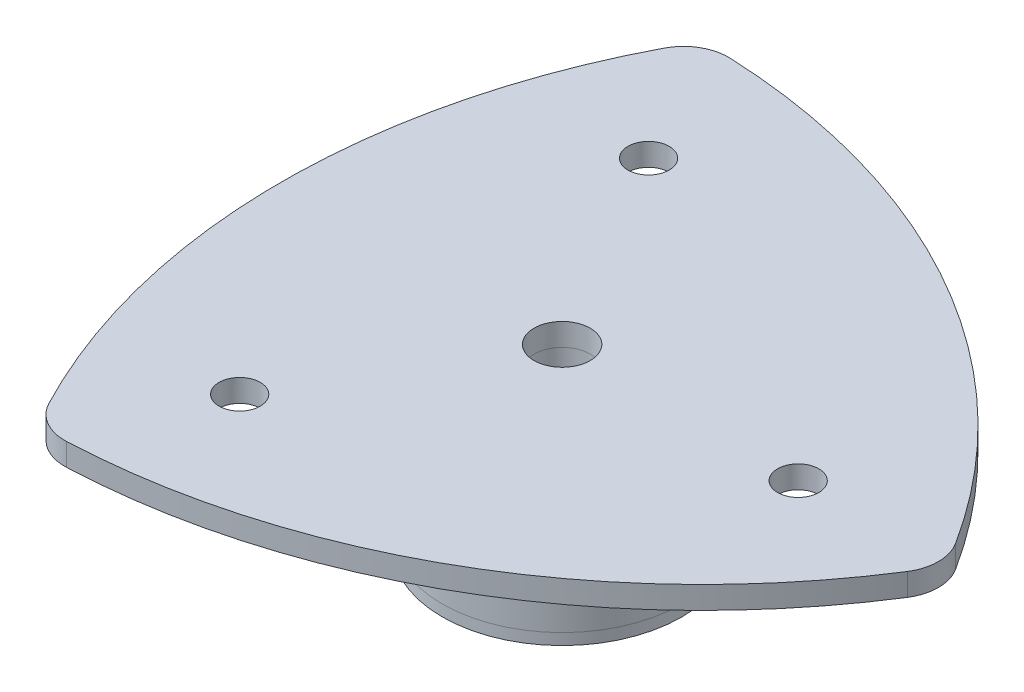
ISO-10303-21;
HEADER;
FILE_DESCRIPTION(('STEP AP214'),'2;1');
FILE_NAME('part.step','',(''),(''),'','','');
FILE_SCHEMA(('AUTOMOTIVE_DESIGN { 1 0 10303 214 1 1 1 1 }'));
ENDSEC;
DATA;
#1=APPLICATION_CONTEXT('core data for automotive mechanical design processes');
#2=APPLICATION_PROTOCOL_DEFINITION('international standard','automotive_design',2000,#1);
#3=PRODUCT_CONTEXT('',#1,'mechanical');
#4=PRODUCT('Part','Part','',(#3));
#5=PRODUCT_RELATED_PRODUCT_CATEGORY('part','',(#4));
#6=PRODUCT_DEFINITION_FORMATION('','',#4);
#7=PRODUCT_DEFINITION_CONTEXT('part definition',#1,'design');
#8=PRODUCT_DEFINITION('design','',#6,#7);
#9=PRODUCT_DEFINITION_SHAPE('','',#8);
#10=(LENGTH_UNIT() NAMED_UNIT(*) SI_UNIT(.MILLI.,.METRE.));
#11=(NAMED_UNIT(*) PLANE_ANGLE_UNIT() SI_UNIT($,.RADIAN.));
#12=(NAMED_UNIT(*) SI_UNIT($,.STERADIAN.) SOLID_ANGLE_UNIT());
#13=UNCERTAINTY_MEASURE_WITH_UNIT(LENGTH_MEASURE(1.E-05),#10,'distance_accuracy_value','');
#14=(GEOMETRIC_REPRESENTATION_CONTEXT(3) GLOBAL_UNCERTAINTY_ASSIGNED_CONTEXT((#13)) GLOBAL_UNIT_ASSIGNED_CONTEXT((#10,
#11,#12)) REPRESENTATION_CONTEXT('',''));
#15=CARTESIAN_POINT('',(0.,0.,0.));
#16=DIRECTION('',(0.,0.,1.));
#17=DIRECTION('',(1.,0.,0.));
#18=AXIS2_PLACEMENT_3D('',#15,#16,#17);
#19=CARTESIAN_POINT('',(0.,47.0000000000002,0.));
#20=DIRECTION('',(0.,1.,0.));
#21=DIRECTION('',(0.,0.,0.999999999999999));
#22=AXIS2_PLACEMENT_3D('',#19,#20,#21);
#23=PLANE('',#22);
#24=CARTESIAN_POINT('',(-31.4999999999999,47.0000000000005,-54.5596004384192));
#25=DIRECTION('',(0.,1.,0.));
#26=DIRECTION('',(0.,0.,0.999999999999999));
#27=AXIS2_PLACEMENT_3D('',#24,#25,#26);
#28=CIRCLE('',#27,5.5);
#29=CARTESIAN_POINT('',(-31.4999999999999,47.0000000000005,-49.0596004384192));
#30=VERTEX_POINT('',#29);
#31=EDGE_CURVE('E491',#30,#30,#28,.T.);
#32=ORIENTED_EDGE('',*,*,#31,.F.);
#33=EDGE_LOOP('',(#32));
#34=FACE_BOUND('',#33,.T.);
#35=CARTESIAN_POINT('',(-31.5000000000001,47.0000000000002,54.5596004384203));
#36=DIRECTION('',(0.,1.,0.));
#37=DIRECTION('',(0.,0.,0.999999999999999));
#38=AXIS2_PLACEMENT_3D('',#35,#36,#37);
#39=CIRCLE('',#38,5.5);
#40=CARTESIAN_POINT('',(-31.5000000000001,47.0000000000002,60.0596004384203));
#41=VERTEX_POINT('',#40);
#42=EDGE_CURVE('E490',#41,#41,#39,.T.);
#43=ORIENTED_EDGE('',*,*,#42,.F.);
#44=EDGE_LOOP('',(#43));
#45=FACE_BOUND('',#44,.T.);
#46=CARTESIAN_POINT('',(63.,47.0000000000003,0.));
#47=DIRECTION('',(0.,1.,0.));
#48=DIRECTION('',(0.,0.,0.999999999999999));
#49=AXIS2_PLACEMENT_3D('',#46,#47,#48);
#50=CIRCLE('',#49,5.5);
#51=CARTESIAN_POINT('',(63.,47.0000000000003,5.50000000000008));
#52=VERTEX_POINT('',#51);
#53=EDGE_CURVE('E480',#52,#52,#50,.T.);
#54=ORIENTED_EDGE('',*,*,#53,.F.);
#55=EDGE_LOOP('',(#54));
#56=FACE_BOUND('',#55,.T.);
#57=CARTESIAN_POINT('',(0.,47.0000000000002,0.));
#58=DIRECTION('',(0.,-1.,0.));
#59=DIRECTION('',(0.,0.,-0.999999999999999));
#60=AXIS2_PLACEMENT_3D('',#57,#58,#59);
#61=CIRCLE('',#60,7.5);
#62=CARTESIAN_POINT('',(0.,47.0000000000001,-7.49999999999997));
#63=VERTEX_POINT('',#62);
#64=EDGE_CURVE('E341',#63,#63,#61,.T.);
#65=ORIENTED_EDGE('',*,*,#64,.T.);
#66=EDGE_LOOP('',(#65));
#67=FACE_BOUND('',#66,.T.);
#68=CARTESIAN_POINT('',(-51.2259526419164,47.0000000000018,88.7259526419169));
#69=DIRECTION('',(0.,1.,0.));
#70=DIRECTION('',(0.,0.,0.999999999999999));
#71=AXIS2_PLACEMENT_3D('',#68,#69,#70);
#72=CIRCLE('',#71,177.451905283833);
#73=CARTESIAN_POINT('',(98.5523471473544,47.0000000000006,-6.43517177923342));
#74=VERTEX_POINT('',#73);
#75=CARTESIAN_POINT('',(-43.703151335144,47.0000000000003,-88.5664221218088));
#76=VERTEX_POINT('',#75);
#77=EDGE_CURVE('E325',#74,#76,#72,.T.);
#78=ORIENTED_EDGE('',*,*,#77,.T.);
#79=CARTESIAN_POINT('',(-44.2118729267036,47.0000000000008,-76.5772102068293));
#80=DIRECTION('',(0.,1.,0.));
#81=DIRECTION('',(0.,0.,0.999999999999999));
#82=AXIS2_PLACEMENT_3D('',#79,#80,#81);
#83=CIRCLE('',#82,12.);
#84=CARTESIAN_POINT('',(-54.8491958122107,47.0000000000018,-82.1312503425742));
#85=VERTEX_POINT('',#84);
#86=EDGE_CURVE('E329',#76,#85,#83,.T.);
#87=ORIENTED_EDGE('',*,*,#86,.T.);
#88=CARTESIAN_POINT('',(102.451905283833,47.,0.));
#89=DIRECTION('',(0.,1.,0.));
#90=DIRECTION('',(0.,0.,0.999999999999999));
#91=AXIS2_PLACEMENT_3D('',#88,#89,#90);
#92=CIRCLE('',#91,177.451905283833);
#93=CARTESIAN_POINT('',(-54.8491958122105,47.0000000000022,82.1312503425755));
#94=VERTEX_POINT('',#93);
#95=EDGE_CURVE('E339',#85,#94,#92,.T.);
#96=ORIENTED_EDGE('',*,*,#95,.T.);
#97=CARTESIAN_POINT('',(-44.2118729267036,47.0000000000022,76.5772102068303));
#98=DIRECTION('',(0.,1.,0.));
#99=DIRECTION('',(0.,0.,0.999999999999999));
#100=AXIS2_PLACEMENT_3D('',#97,#98,#99);
#101=CIRCLE('',#100,12.);
#102=CARTESIAN_POINT('',(-43.703151335144,47.0000000000002,88.5664221218089));
#103=VERTEX_POINT('',#102);
#104=EDGE_CURVE('E328',#94,#103,#101,.T.);
#105=ORIENTED_EDGE('',*,*,#104,.T.);
#106=CARTESIAN_POINT('',(-51.2259526419165,47.0000000000005,-88.7259526419162));
#107=DIRECTION('',(0.,1.,0.));
#108=DIRECTION('',(0.,0.,0.999999999999999));
#109=AXIS2_PLACEMENT_3D('',#106,#107,#108);
#110=CIRCLE('',#109,177.451905283833);
#111=CARTESIAN_POINT('',(98.5523471473546,47.0000000000019,6.43517177923442));
#112=VERTEX_POINT('',#111);
#113=EDGE_CURVE('E324',#103,#112,#110,.T.);
#114=ORIENTED_EDGE('',*,*,#113,.T.);
#115=CARTESIAN_POINT('',(88.4237458534072,47.0000000000009,1.66533453693773E-13));
#116=DIRECTION('',(0.,1.,0.));
#117=DIRECTION('',(0.,0.,0.999999999999999));
#118=AXIS2_PLACEMENT_3D('',#115,#116,#117);
#119=CIRCLE('',#118,12.);
#120=EDGE_CURVE('E318',#112,#74,#119,.T.);
#121=ORIENTED_EDGE('',*,*,#120,.T.);
#122=EDGE_LOOP('',(#78,#87,#96,#105,#114,#121));
#123=FACE_BOUND('',#122,.T.);
#124=ADVANCED_FACE('F265',(#34,#45,#56,#67,#123),#23,.T.);
#125=CARTESIAN_POINT('',(0.,0.,0.));
#126=DIRECTION('',(0.,-1.,0.));
#127=DIRECTION('',(0.,0.,-0.999999999999999));
#128=AXIS2_PLACEMENT_3D('',#125,#126,#127);
#129=CYLINDRICAL_SURFACE('',#128,7.5);
#130=CARTESIAN_POINT('',(0.,41.,0.));
#131=DIRECTION('',(0.,-1.,0.));
#132=DIRECTION('',(0.,0.,-0.999999999999999));
#133=AXIS2_PLACEMENT_3D('',#130,#131,#132);
#134=CIRCLE('',#133,7.5);
#135=CARTESIAN_POINT('',(0.,41.,-7.49999999999994));
#136=VERTEX_POINT('',#135);
#137=EDGE_CURVE('E351',#136,#136,#134,.T.);
#138=ORIENTED_EDGE('',*,*,#137,.T.);
#139=EDGE_LOOP('',(#138));
#140=FACE_BOUND('',#139,.T.);
#141=ORIENTED_EDGE('',*,*,#64,.F.);
#142=EDGE_LOOP('',(#141));
#143=FACE_BOUND('',#142,.T.);
#144=ADVANCED_FACE('F427',(#140,#143),#129,.F.);
#145=CARTESIAN_POINT('',(0.,41.,0.));
#146=DIRECTION('',(0.,1.,0.));
#147=DIRECTION('',(0.,0.,0.999999999999999));
#148=AXIS2_PLACEMENT_3D('',#145,#146,#147);
#149=PLANE('',#148);
#150=ORIENTED_EDGE('',*,*,#137,.F.);
#151=EDGE_LOOP('',(#150));
#152=FACE_BOUND('',#151,.T.);
#153=CARTESIAN_POINT('',(0.,41.,0.));
#154=DIRECTION('',(0.,-1.,0.));
#155=DIRECTION('',(0.,0.,-0.999999999999999));
#156=AXIS2_PLACEMENT_3D('',#153,#154,#155);
#157=CIRCLE('',#156,32.);
#158=CARTESIAN_POINT('',(0.,41.,-31.9999999999999));
#159=VERTEX_POINT('',#158);
#160=EDGE_CURVE('E422',#159,#159,#157,.T.);
#161=ORIENTED_EDGE('',*,*,#160,.T.);
#162=EDGE_LOOP('',(#161));
#163=FACE_BOUND('',#162,.T.);
#164=ADVANCED_FACE('F433',(#152,#163),#149,.F.);
#165=CARTESIAN_POINT('',(0.,0.,0.));
#166=DIRECTION('',(0.,-1.,0.));
#167=DIRECTION('',(0.,0.,-0.999999999999999));
#168=AXIS2_PLACEMENT_3D('',#165,#166,#167);
#169=CYLINDRICAL_SURFACE('',#168,32.);
#170=ORIENTED_EDGE('',*,*,#160,.F.);
#171=EDGE_LOOP('',(#170));
#172=FACE_BOUND('',#171,.T.);
#173=CARTESIAN_POINT('',(-4.16333634234434E-13,27.0000000000019,7.21644966006352E-13));
#174=DIRECTION('',(0.,-1.,0.));
#175=DIRECTION('',(0.,0.,-0.999999999999999));
#176=AXIS2_PLACEMENT_3D('',#173,#174,#175);
#177=CIRCLE('',#176,32.);
#178=CARTESIAN_POINT('',(-4.67847982577041E-13,27.0000000000019,-31.9999999999993));
#179=VERTEX_POINT('',#178);
#180=EDGE_CURVE('E419',#179,#179,#177,.T.);
#181=ORIENTED_EDGE('',*,*,#180,.T.);
#182=EDGE_LOOP('',(#181));
#183=FACE_BOUND('',#182,.T.);
#184=ADVANCED_FACE('F436',(#172,#183),#169,.F.);
#185=CARTESIAN_POINT('',(-4.16333634234434E-13,27.0000000000019,7.21644966006352E-13));
#186=DIRECTION('',(0.,-1.,0.));
#187=DIRECTION('',(0.,0.,-0.999999999999999));
#188=AXIS2_PLACEMENT_3D('',#185,#186,#187);
#189=PLANE('',#188);
#190=CARTESIAN_POINT('',(-4.16333634234434E-13,27.0000000000019,7.21644966006352E-13));
#191=DIRECTION('',(0.,-1.,0.));
#192=DIRECTION('',(0.,0.,-0.999999999999999));
#193=AXIS2_PLACEMENT_3D('',#190,#191,#192);
#194=CIRCLE('',#193,38.);
#195=CARTESIAN_POINT('',(-4.7750692289128E-13,27.0000000000019,-37.9999999999992));
#196=VERTEX_POINT('',#195);
#197=EDGE_CURVE('E413',#196,#196,#194,.T.);
#198=ORIENTED_EDGE('',*,*,#197,.T.);
#199=EDGE_LOOP('',(#198));
#200=FACE_BOUND('',#199,.T.);
#201=ORIENTED_EDGE('',*,*,#180,.F.);
#202=EDGE_LOOP('',(#201));
#203=FACE_BOUND('',#202,.T.);
#204=ADVANCED_FACE('F445',(#200,#203),#189,.T.);
#205=CARTESIAN_POINT('',(0.,0.,0.));
#206=DIRECTION('',(0.,-1.,0.));
#207=DIRECTION('',(0.,0.,-0.999999999999999));
#208=AXIS2_PLACEMENT_3D('',#205,#206,#207);
#209=CYLINDRICAL_SURFACE('',#208,38.);
#210=CARTESIAN_POINT('',(0.,41.,0.));
#211=DIRECTION('',(0.,-1.,0.));
#212=DIRECTION('',(0.,0.,-0.999999999999999));
#213=AXIS2_PLACEMENT_3D('',#210,#211,#212);
#214=CIRCLE('',#213,38.);
#215=CARTESIAN_POINT('',(0.,41.,-37.9999999999999));
#216=VERTEX_POINT('',#215);
#217=EDGE_CURVE('E408',#216,#216,#214,.T.);
#218=ORIENTED_EDGE('',*,*,#217,.T.);
#219=EDGE_LOOP('',(#218));
#220=FACE_BOUND('',#219,.T.);
#221=ORIENTED_EDGE('',*,*,#197,.F.);
#222=EDGE_LOOP('',(#221));
#223=FACE_BOUND('',#222,.T.);
#224=ADVANCED_FACE('F450',(#220,#223),#209,.T.);
#225=CARTESIAN_POINT('',(0.,41.,0.));
#226=DIRECTION('',(0.,-1.,0.));
#227=DIRECTION('',(0.,0.,-0.999999999999999));
#228=AXIS2_PLACEMENT_3D('',#225,#226,#227);
#229=PLANE('',#228);
#230=CARTESIAN_POINT('',(-31.4999999999998,41.000000000003,-54.5596004384187));
#231=DIRECTION('',(0.,-1.,0.));
#232=DIRECTION('',(0.,0.,-0.999999999999999));
#233=AXIS2_PLACEMENT_3D('',#230,#231,#232);
#234=CIRCLE('',#233,5.5);
#235=CARTESIAN_POINT('',(-31.4999999999998,41.000000000003,-60.0596004384187));
#236=VERTEX_POINT('',#235);
#237=EDGE_CURVE('E479',#236,#236,#234,.F.);
#238=ORIENTED_EDGE('',*,*,#237,.T.);
#239=EDGE_LOOP('',(#238));
#240=FACE_BOUND('',#239,.T.);
#241=CARTESIAN_POINT('',(-31.5,41.0000000000013,54.5596004384198));
#242=DIRECTION('',(0.,-1.,0.));
#243=DIRECTION('',(0.,0.,-0.999999999999999));
#244=AXIS2_PLACEMENT_3D('',#241,#242,#243);
#245=CIRCLE('',#244,5.5);
#246=CARTESIAN_POINT('',(-31.5,41.0000000000013,49.0596004384198));
#247=VERTEX_POINT('',#246);
#248=EDGE_CURVE('E483',#247,#247,#245,.F.);
#249=ORIENTED_EDGE('',*,*,#248,.T.);
#250=EDGE_LOOP('',(#249));
#251=FACE_BOUND('',#250,.T.);
#252=CARTESIAN_POINT('',(62.9999999999999,41.0000000000034,6.10622663543836E-13));
#253=DIRECTION('',(0.,-1.,0.));
#254=DIRECTION('',(0.,0.,-0.999999999999999));
#255=AXIS2_PLACEMENT_3D('',#252,#253,#254);
#256=CIRCLE('',#255,5.5);
#257=CARTESIAN_POINT('',(62.9999999999999,41.0000000000034,-5.49999999999939));
#258=VERTEX_POINT('',#257);
#259=EDGE_CURVE('E485',#258,#258,#256,.F.);
#260=ORIENTED_EDGE('',*,*,#259,.T.);
#261=EDGE_LOOP('',(#260));
#262=FACE_BOUND('',#261,.T.);
#263=CARTESIAN_POINT('',(102.451905283833,41.0000000000028,7.21644966006352E-13));
#264=DIRECTION('',(0.,-1.,0.));
#265=DIRECTION('',(0.,0.,-0.999999999999999));
#266=AXIS2_PLACEMENT_3D('',#263,#264,#265);
#267=CIRCLE('',#266,177.451905283833);
#268=CARTESIAN_POINT('',(-54.8491958122106,41.,-82.131250342575));
#269=VERTEX_POINT('',#268);
#270=CARTESIAN_POINT('',(-54.8491958122105,41.,82.131250342575));
#271=VERTEX_POINT('',#270);
#272=EDGE_CURVE('E391',#269,#271,#267,.F.);
#273=ORIENTED_EDGE('',*,*,#272,.F.);
#274=CARTESIAN_POINT('',(-44.2118729267036,41.0000000000017,-76.5772102068292));
#275=DIRECTION('',(0.,-1.,0.));
#276=DIRECTION('',(0.,0.,-0.999999999999999));
#277=AXIS2_PLACEMENT_3D('',#274,#275,#276);
#278=CIRCLE('',#277,12.);
#279=CARTESIAN_POINT('',(-43.7031513351442,41.000000000001,-88.5664221218085));
#280=VERTEX_POINT('',#279);
#281=EDGE_CURVE('E371',#269,#280,#278,.T.);
#282=ORIENTED_EDGE('',*,*,#281,.T.);
#283=CARTESIAN_POINT('',(-51.2259526419165,41.0000000000033,88.7259526419171));
#284=DIRECTION('',(0.,-1.,0.));
#285=DIRECTION('',(0.,0.,-0.999999999999999));
#286=AXIS2_PLACEMENT_3D('',#283,#284,#285);
#287=CIRCLE('',#286,177.451905283833);
#288=CARTESIAN_POINT('',(98.5523471473545,41.0000000000001,-6.43517177923386));
#289=VERTEX_POINT('',#288);
#290=EDGE_CURVE('E386',#289,#280,#287,.F.);
#291=ORIENTED_EDGE('',*,*,#290,.F.);
#292=CARTESIAN_POINT('',(88.4237458534069,41.0000000000017,8.60422844084496E-13));
#293=DIRECTION('',(0.,-1.,0.));
#294=DIRECTION('',(0.,0.,-0.999999999999999));
#295=AXIS2_PLACEMENT_3D('',#292,#293,#294);
#296=CIRCLE('',#295,12.);
#297=CARTESIAN_POINT('',(98.5523471473545,41.0000000000028,6.43517177923442));
#298=VERTEX_POINT('',#297);
#299=EDGE_CURVE('E281',#289,#298,#296,.T.);
#300=ORIENTED_EDGE('',*,*,#299,.T.);
#301=CARTESIAN_POINT('',(-51.2259526419165,41.0000000000014,-88.725952641916));
#302=DIRECTION('',(0.,-1.,0.));
#303=DIRECTION('',(0.,0.,-0.999999999999999));
#304=AXIS2_PLACEMENT_3D('',#301,#302,#303);
#305=CIRCLE('',#304,177.451905283833);
#306=CARTESIAN_POINT('',(-43.7031513351441,41.,88.566422121809));
#307=VERTEX_POINT('',#306);
#308=EDGE_CURVE('E338',#307,#298,#305,.F.);
#309=ORIENTED_EDGE('',*,*,#308,.F.);
#310=CARTESIAN_POINT('',(-44.2118729267036,41.0000000000028,76.5772102068302));
#311=DIRECTION('',(0.,-1.,0.));
#312=DIRECTION('',(0.,0.,-0.999999999999999));
#313=AXIS2_PLACEMENT_3D('',#310,#311,#312);
#314=CIRCLE('',#313,12.);
#315=EDGE_CURVE('E366',#307,#271,#314,.T.);
#316=ORIENTED_EDGE('',*,*,#315,.T.);
#317=EDGE_LOOP('',(#273,#282,#291,#300,#309,#316));
#318=FACE_BOUND('',#317,.T.);
#319=ORIENTED_EDGE('',*,*,#217,.F.);
#320=EDGE_LOOP('',(#319));
#321=FACE_BOUND('',#320,.T.);
#322=ADVANCED_FACE('F390',(#240,#251,#262,#318,#321),#229,.T.);
#323=CARTESIAN_POINT('',(-51.2259526419165,-104.236875482778,88.7259526419165));
#324=DIRECTION('',(0.,1.,0.));
#325=DIRECTION('',(0.,0.,0.999999999999999));
#326=AXIS2_PLACEMENT_3D('',#323,#324,#325);
#327=CYLINDRICAL_SURFACE('',#326,177.451905283833);
#328=ORIENTED_EDGE('',*,*,#290,.T.);
#329=DIRECTION('',(0.,1.,0.));
#330=VECTOR('',#329,1.);
#331=CARTESIAN_POINT('',(-43.7031513351442,-104.236875482777,-88.5664221218087));
#332=LINE('',#331,#330);
#333=EDGE_CURVE('E340',#280,#76,#332,.T.);
#334=ORIENTED_EDGE('',*,*,#333,.T.);
#335=ORIENTED_EDGE('',*,*,#77,.F.);
#336=DIRECTION('',(0.,1.,0.));
#337=VECTOR('',#336,1.);
#338=CARTESIAN_POINT('',(98.5523471473541,-104.236875482776,-6.43517177923297));
#339=LINE('',#338,#337);
#340=EDGE_CURVE('E333',#74,#289,#339,.F.);
#341=ORIENTED_EDGE('',*,*,#340,.T.);
#342=EDGE_LOOP('',(#328,#334,#335,#341));
#343=FACE_BOUND('',#342,.T.);
#344=ADVANCED_FACE('F331',(#343),#327,.T.);
#345=CARTESIAN_POINT('',(102.451905283833,-104.236875482777,1.66533453693773E-13));
#346=DIRECTION('',(0.,1.,0.));
#347=DIRECTION('',(0.,0.,0.999999999999999));
#348=AXIS2_PLACEMENT_3D('',#345,#346,#347);
#349=CYLINDRICAL_SURFACE('',#348,177.451905283833);
#350=ORIENTED_EDGE('',*,*,#95,.F.);
#351=DIRECTION('',(0.,1.,0.));
#352=VECTOR('',#351,1.);
#353=CARTESIAN_POINT('',(-54.8491958122106,-104.236875482778,-82.131250342575));
#354=LINE('',#353,#352);
#355=EDGE_CURVE('E361',#85,#269,#354,.F.);
#356=ORIENTED_EDGE('',*,*,#355,.T.);
#357=ORIENTED_EDGE('',*,*,#272,.T.);
#358=DIRECTION('',(0.,1.,0.));
#359=VECTOR('',#358,1.);
#360=CARTESIAN_POINT('',(-54.8491958122107,-104.236875482777,82.1312503425752));
#361=LINE('',#360,#359);
#362=EDGE_CURVE('E360',#271,#94,#361,.T.);
#363=ORIENTED_EDGE('',*,*,#362,.T.);
#364=EDGE_LOOP('',(#350,#356,#357,#363));
#365=FACE_BOUND('',#364,.T.);
#366=ADVANCED_FACE('F398',(#365),#349,.T.);
#367=CARTESIAN_POINT('',(-51.2259526419165,-104.236875482778,-88.7259526419164));
#368=DIRECTION('',(0.,1.,0.));
#369=DIRECTION('',(0.,0.,0.999999999999999));
#370=AXIS2_PLACEMENT_3D('',#367,#368,#369);
#371=CYLINDRICAL_SURFACE('',#370,177.451905283833);
#372=ORIENTED_EDGE('',*,*,#308,.T.);
#373=DIRECTION('',(0.,1.,0.));
#374=VECTOR('',#373,1.);
#375=CARTESIAN_POINT('',(98.5523471473543,-104.236875482778,6.43517177923414));
#376=LINE('',#375,#374);
#377=EDGE_CURVE('E13',#298,#112,#376,.T.);
#378=ORIENTED_EDGE('',*,*,#377,.T.);
#379=ORIENTED_EDGE('',*,*,#113,.F.);
#380=DIRECTION('',(0.,1.,0.));
#381=VECTOR('',#380,1.);
#382=CARTESIAN_POINT('',(-43.7031513351441,-104.236875482777,88.5664221218092));
#383=LINE('',#382,#381);
#384=EDGE_CURVE('E274',#103,#307,#383,.F.);
#385=ORIENTED_EDGE('',*,*,#384,.T.);
#386=EDGE_LOOP('',(#372,#378,#379,#385));
#387=FACE_BOUND('',#386,.T.);
#388=ADVANCED_FACE('F516',(#387),#371,.T.);
#389=CARTESIAN_POINT('',(62.9999999999999,25.4436508138969,3.60822483003176E-13));
#390=DIRECTION('',(0.,1.,0.));
#391=DIRECTION('',(0.,0.,0.999999999999999));
#392=AXIS2_PLACEMENT_3D('',#389,#390,#391);
#393=CYLINDRICAL_SURFACE('',#392,5.5);
#394=ORIENTED_EDGE('',*,*,#53,.T.);
#395=EDGE_LOOP('',(#394));
#396=FACE_BOUND('',#395,.T.);
#397=ORIENTED_EDGE('',*,*,#259,.F.);
#398=EDGE_LOOP('',(#397));
#399=FACE_BOUND('',#398,.T.);
#400=ADVANCED_FACE('F520',(#396,#399),#393,.F.);
#401=CARTESIAN_POINT('',(-31.5,25.443650813896,54.5596004384197));
#402=DIRECTION('',(0.,1.,0.));
#403=DIRECTION('',(0.,0.,0.999999999999999));
#404=AXIS2_PLACEMENT_3D('',#401,#402,#403);
#405=CYLINDRICAL_SURFACE('',#404,5.5);
#406=ORIENTED_EDGE('',*,*,#42,.T.);
#407=EDGE_LOOP('',(#406));
#408=FACE_BOUND('',#407,.T.);
#409=ORIENTED_EDGE('',*,*,#248,.F.);
#410=EDGE_LOOP('',(#409));
#411=FACE_BOUND('',#410,.T.);
#412=ADVANCED_FACE('F506',(#408,#411),#405,.F.);
#413=CARTESIAN_POINT('',(-31.5,25.443650813896,-54.5596004384196));
#414=DIRECTION('',(0.,1.,0.));
#415=DIRECTION('',(0.,0.,0.999999999999999));
#416=AXIS2_PLACEMENT_3D('',#413,#414,#415);
#417=CYLINDRICAL_SURFACE('',#416,5.5);
#418=ORIENTED_EDGE('',*,*,#31,.T.);
#419=EDGE_LOOP('',(#418));
#420=FACE_BOUND('',#419,.T.);
#421=ORIENTED_EDGE('',*,*,#237,.F.);
#422=EDGE_LOOP('',(#421));
#423=FACE_BOUND('',#422,.T.);
#424=ADVANCED_FACE('F467',(#420,#423),#417,.F.);
#425=CARTESIAN_POINT('',(-44.2118729267037,-104.236875482775,-76.5772102068291));
#426=DIRECTION('',(0.,1.,0.));
#427=DIRECTION('',(0.,0.,0.999999999999999));
#428=AXIS2_PLACEMENT_3D('',#425,#426,#427);
#429=CYLINDRICAL_SURFACE('',#428,12.);
#430=ORIENTED_EDGE('',*,*,#281,.F.);
#431=ORIENTED_EDGE('',*,*,#355,.F.);
#432=ORIENTED_EDGE('',*,*,#86,.F.);
#433=ORIENTED_EDGE('',*,*,#333,.F.);
#434=EDGE_LOOP('',(#430,#431,#432,#433));
#435=FACE_BOUND('',#434,.T.);
#436=ADVANCED_FACE('F397',(#435),#429,.T.);
#437=CARTESIAN_POINT('',(88.4237458534071,-104.236875482774,8.88178419700125E-13));
#438=DIRECTION('',(0.,1.,0.));
#439=DIRECTION('',(0.,0.,0.999999999999999));
#440=AXIS2_PLACEMENT_3D('',#437,#438,#439);
#441=CYLINDRICAL_SURFACE('',#440,12.);
#442=ORIENTED_EDGE('',*,*,#299,.F.);
#443=ORIENTED_EDGE('',*,*,#340,.F.);
#444=ORIENTED_EDGE('',*,*,#120,.F.);
#445=ORIENTED_EDGE('',*,*,#377,.F.);
#446=EDGE_LOOP('',(#442,#443,#444,#445));
#447=FACE_BOUND('',#446,.T.);
#448=ADVANCED_FACE('F345',(#447),#441,.T.);
#449=CARTESIAN_POINT('',(-44.2118729267036,-104.236875482775,76.5772102068303));
#450=DIRECTION('',(0.,1.,0.));
#451=DIRECTION('',(0.,0.,0.999999999999999));
#452=AXIS2_PLACEMENT_3D('',#449,#450,#451);
#453=CYLINDRICAL_SURFACE('',#452,12.);
#454=ORIENTED_EDGE('',*,*,#315,.F.);
#455=ORIENTED_EDGE('',*,*,#384,.F.);
#456=ORIENTED_EDGE('',*,*,#104,.F.);
#457=ORIENTED_EDGE('',*,*,#362,.F.);
#458=EDGE_LOOP('',(#454,#455,#456,#457));
#459=FACE_BOUND('',#458,.T.);
#460=ADVANCED_FACE('F269',(#459),#453,.T.);
#461=CLOSED_SHELL('',(#124,#144,#164,#184,#204,#224,#322,#344,#366,#388,#400,#412,#424,#436,
#448,#460));
#462=MANIFOLD_SOLID_BREP('B2',#461);
#463=CARTESIAN_POINT('',(-2.77555756156289E-13,3.00000000000145,3.88578058618805E-13));
#464=DIRECTION('',(0.,1.,0.));
#465=DIRECTION('',(0.,0.,0.999999999999999));
#466=AXIS2_PLACEMENT_3D('',#463,#464,#465);
#467=PLANE('',#466);
#468=CARTESIAN_POINT('',(-2.77555756156289E-13,3.00000000000145,3.88578058618805E-13));
#469=DIRECTION('',(0.,-1.,0.));
#470=DIRECTION('',(0.,0.,-0.999999999999999));
#471=AXIS2_PLACEMENT_3D('',#468,#469,#470);
#472=CIRCLE('',#471,9.5);
#473=CARTESIAN_POINT('',(-2.93903790193895E-13,3.00000000000144,-9.49999999999961));
#474=VERTEX_POINT('',#473);
#475=EDGE_CURVE('E703',#474,#474,#472,.T.);
#476=ORIENTED_EDGE('',*,*,#475,.F.);
#477=EDGE_LOOP('',(#476));
#478=FACE_BOUND('',#477,.T.);
#479=CARTESIAN_POINT('',(-2.77555756156289E-13,3.00000000000145,3.88578058618805E-13));
#480=DIRECTION('',(0.,-1.,0.));
#481=DIRECTION('',(0.,0.,-0.999999999999999));
#482=AXIS2_PLACEMENT_3D('',#479,#480,#481);
#483=CIRCLE('',#482,32.);
#484=CARTESIAN_POINT('',(-3.32622818177697E-13,3.00000000000143,-31.9999999999996));
#485=VERTEX_POINT('',#484);
#486=EDGE_CURVE('E263',#485,#485,#483,.T.);
#487=ORIENTED_EDGE('',*,*,#486,.T.);
#488=EDGE_LOOP('',(#487));
#489=FACE_BOUND('',#488,.T.);
#490=ADVANCED_FACE('F684',(#478,#489),#467,.F.);
#491=CARTESIAN_POINT('',(0.,0.,0.));
#492=DIRECTION('',(0.,-1.,0.));
#493=DIRECTION('',(0.,0.,-0.999999999999999));
#494=AXIS2_PLACEMENT_3D('',#491,#492,#493);
#495=CYLINDRICAL_SURFACE('',#494,32.);
#496=CARTESIAN_POINT('',(0.,41.,0.));
#497=DIRECTION('',(0.,-1.,0.));
#498=DIRECTION('',(0.,0.,-0.999999999999999));
#499=AXIS2_PLACEMENT_3D('',#496,#497,#498);
#500=CIRCLE('',#499,32.);
#501=CARTESIAN_POINT('',(0.,41.,-31.9999999999999));
#502=VERTEX_POINT('',#501);
#503=EDGE_CURVE('E695',#502,#502,#500,.T.);
#504=ORIENTED_EDGE('',*,*,#503,.T.);
#505=EDGE_LOOP('',(#504));
#506=FACE_BOUND('',#505,.T.);
#507=ORIENTED_EDGE('',*,*,#486,.F.);
#508=EDGE_LOOP('',(#507));
#509=FACE_BOUND('',#508,.T.);
#510=ADVANCED_FACE('F713',(#506,#509),#495,.T.);
#511=CARTESIAN_POINT('',(0.,41.,0.));
#512=DIRECTION('',(0.,-1.,0.));
#513=DIRECTION('',(0.,0.,-0.999999999999999));
#514=AXIS2_PLACEMENT_3D('',#511,#512,#513);
#515=PLANE('',#514);
#516=ORIENTED_EDGE('',*,*,#503,.F.);
#517=EDGE_LOOP('',(#516));
#518=FACE_BOUND('',#517,.T.);
#519=CARTESIAN_POINT('',(0.,41.,0.));
#520=DIRECTION('',(0.,-1.,0.));
#521=DIRECTION('',(0.,0.,-0.999999999999999));
#522=AXIS2_PLACEMENT_3D('',#519,#520,#521);
#523=CIRCLE('',#522,9.5);
#524=CARTESIAN_POINT('',(0.,41.,-9.49999999999994));
#525=VERTEX_POINT('',#524);
#526=EDGE_CURVE('E698',#525,#525,#523,.T.);
#527=ORIENTED_EDGE('',*,*,#526,.T.);
#528=EDGE_LOOP('',(#527));
#529=FACE_BOUND('',#528,.T.);
#530=ADVANCED_FACE('F718',(#518,#529),#515,.F.);
#531=CARTESIAN_POINT('',(0.,0.,0.));
#532=DIRECTION('',(0.,-1.,0.));
#533=DIRECTION('',(0.,0.,-0.999999999999999));
#534=AXIS2_PLACEMENT_3D('',#531,#532,#533);
#535=CYLINDRICAL_SURFACE('',#534,9.5);
#536=ORIENTED_EDGE('',*,*,#526,.F.);
#537=EDGE_LOOP('',(#536));
#538=FACE_BOUND('',#537,.T.);
#539=ORIENTED_EDGE('',*,*,#475,.T.);
#540=EDGE_LOOP('',(#539));
#541=FACE_BOUND('',#540,.T.);
#542=ADVANCED_FACE('F715',(#538,#541),#535,.F.);
#543=CLOSED_SHELL('',(#490,#510,#530,#542));
#544=MANIFOLD_SOLID_BREP('B7',#543);
#545=CARTESIAN_POINT('',(0.,0.,0.));
#546=DIRECTION('',(0.,-1.,0.));
#547=DIRECTION('',(0.,0.,-0.999999999999999));
#548=AXIS2_PLACEMENT_3D('',#545,#546,#547);
#549=CYLINDRICAL_SURFACE('',#548,30.);
#550=CARTESIAN_POINT('',(0.,0.,0.));
#551=DIRECTION('',(0.,-1.,0.));
#552=DIRECTION('',(0.,0.,-0.999999999999999));
#553=AXIS2_PLACEMENT_3D('',#550,#551,#552);
#554=CIRCLE('',#553,30.);
#555=CARTESIAN_POINT('',(0.,0.,-30.));
#556=VERTEX_POINT('',#555);
#557=EDGE_CURVE('E685',#556,#556,#554,.T.);
#558=ORIENTED_EDGE('',*,*,#557,.T.);
#559=EDGE_LOOP('',(#558));
#560=FACE_BOUND('',#559,.T.);
#561=CARTESIAN_POINT('',(-1.66533453693773E-13,1.00000000000355,8.32667268468867E-13));
#562=DIRECTION('',(0.,-1.,0.));
#563=DIRECTION('',(0.,0.,-0.999999999999999));
#564=AXIS2_PLACEMENT_3D('',#561,#562,#563);
#565=CIRCLE('',#564,30.);
#566=CARTESIAN_POINT('',(-2.18158824338843E-13,1.00000000000354,-29.9999999999991));
#567=VERTEX_POINT('',#566);
#568=EDGE_CURVE('E799',#567,#567,#565,.T.);
#569=ORIENTED_EDGE('',*,*,#568,.F.);
#570=EDGE_LOOP('',(#569));
#571=FACE_BOUND('',#570,.T.);
#572=ADVANCED_FACE('F761',(#560,#571),#549,.F.);
#573=CARTESIAN_POINT('',(30.,0.,0.));
#574=DIRECTION('',(0.,-1.,0.));
#575=DIRECTION('',(0.,0.,-0.999999999999999));
#576=AXIS2_PLACEMENT_3D('',#573,#574,#575);
#577=PLANE('',#576);
#578=CARTESIAN_POINT('',(0.,0.,0.));
#579=DIRECTION('',(0.,-1.,0.));
#580=DIRECTION('',(0.,0.,-0.999999999999999));
#581=AXIS2_PLACEMENT_3D('',#578,#579,#580);
#582=CIRCLE('',#581,32.);
#583=CARTESIAN_POINT('',(0.,0.,-32.));
#584=VERTEX_POINT('',#583);
#585=EDGE_CURVE('E767',#584,#584,#582,.T.);
#586=ORIENTED_EDGE('',*,*,#585,.T.);
#587=EDGE_LOOP('',(#586));
#588=FACE_BOUND('',#587,.T.);
#589=ORIENTED_EDGE('',*,*,#557,.F.);
#590=EDGE_LOOP('',(#589));
#591=FACE_BOUND('',#590,.T.);
#592=ADVANCED_FACE('F809',(#588,#591),#577,.T.);
#593=CARTESIAN_POINT('',(0.,0.,0.));
#594=DIRECTION('',(0.,-1.,0.));
#595=DIRECTION('',(0.,0.,-0.999999999999999));
#596=AXIS2_PLACEMENT_3D('',#593,#594,#595);
#597=CYLINDRICAL_SURFACE('',#596,32.);
#598=CARTESIAN_POINT('',(-2.77555756156289E-13,3.00000000000145,3.88578058618805E-13));
#599=DIRECTION('',(0.,-1.,0.));
#600=DIRECTION('',(0.,0.,-0.999999999999999));
#601=AXIS2_PLACEMENT_3D('',#598,#599,#600);
#602=CIRCLE('',#601,32.);
#603=CARTESIAN_POINT('',(-3.32622818177697E-13,3.00000000000143,-31.9999999999996));
#604=VERTEX_POINT('',#603);
#605=EDGE_CURVE('E771',#604,#604,#602,.T.);
#606=ORIENTED_EDGE('',*,*,#605,.T.);
#607=EDGE_LOOP('',(#606));
#608=FACE_BOUND('',#607,.T.);
#609=ORIENTED_EDGE('',*,*,#585,.F.);
#610=EDGE_LOOP('',(#609));
#611=FACE_BOUND('',#610,.T.);
#612=ADVANCED_FACE('F812',(#608,#611),#597,.T.);
#613=CARTESIAN_POINT('',(31.9999999999997,3.00000000000022,2.77555756156289E-13));
#614=DIRECTION('',(0.,1.,0.));
#615=DIRECTION('',(0.,0.,0.999999999999999));
#616=AXIS2_PLACEMENT_3D('',#613,#614,#615);
#617=PLANE('',#616);
#618=CARTESIAN_POINT('',(-2.77555756156289E-13,3.00000000000145,3.88578058618805E-13));
#619=DIRECTION('',(0.,-1.,0.));
#620=DIRECTION('',(0.,0.,-0.999999999999999));
#621=AXIS2_PLACEMENT_3D('',#618,#619,#620);
#622=CIRCLE('',#621,9.5);
#623=CARTESIAN_POINT('',(-2.93903790193895E-13,3.00000000000144,-9.49999999999961));
#624=VERTEX_POINT('',#623);
#625=EDGE_CURVE('E778',#624,#624,#622,.T.);
#626=ORIENTED_EDGE('',*,*,#625,.T.);
#627=EDGE_LOOP('',(#626));
#628=FACE_BOUND('',#627,.T.);
#629=ORIENTED_EDGE('',*,*,#605,.F.);
#630=EDGE_LOOP('',(#629));
#631=FACE_BOUND('',#630,.T.);
#632=ADVANCED_FACE('F818',(#628,#631),#617,.T.);
#633=CARTESIAN_POINT('',(0.,0.,0.));
#634=DIRECTION('',(0.,-1.,0.));
#635=DIRECTION('',(0.,0.,-0.999999999999999));
#636=AXIS2_PLACEMENT_3D('',#633,#634,#635);
#637=CYLINDRICAL_SURFACE('',#636,9.5);
#638=CARTESIAN_POINT('',(0.,41.,0.));
#639=DIRECTION('',(0.,-1.,0.));
#640=DIRECTION('',(0.,0.,-0.999999999999999));
#641=AXIS2_PLACEMENT_3D('',#638,#639,#640);
#642=CIRCLE('',#641,9.50000000000001);
#643=CARTESIAN_POINT('',(0.,41.,-9.49999999999994));
#644=VERTEX_POINT('',#643);
#645=EDGE_CURVE('E787',#644,#644,#642,.T.);
#646=ORIENTED_EDGE('',*,*,#645,.T.);
#647=EDGE_LOOP('',(#646));
#648=FACE_BOUND('',#647,.T.);
#649=ORIENTED_EDGE('',*,*,#625,.F.);
#650=EDGE_LOOP('',(#649));
#651=FACE_BOUND('',#650,.T.);
#652=ADVANCED_FACE('F823',(#648,#651),#637,.T.);
#653=CARTESIAN_POINT('',(9.50000000000001,41.,0.));
#654=DIRECTION('',(0.,1.,0.));
#655=DIRECTION('',(0.,0.,0.999999999999999));
#656=AXIS2_PLACEMENT_3D('',#653,#654,#655);
#657=PLANE('',#656);
#658=CARTESIAN_POINT('',(0.,41.,0.));
#659=DIRECTION('',(0.,-1.,0.));
#660=DIRECTION('',(0.,0.,-0.999999999999999));
#661=AXIS2_PLACEMENT_3D('',#658,#659,#660);
#662=CIRCLE('',#661,7.5);
#663=CARTESIAN_POINT('',(0.,41.,-7.49999999999994));
#664=VERTEX_POINT('',#663);
#665=EDGE_CURVE('E788',#664,#664,#662,.T.);
#666=ORIENTED_EDGE('',*,*,#665,.T.);
#667=EDGE_LOOP('',(#666));
#668=FACE_BOUND('',#667,.T.);
#669=ORIENTED_EDGE('',*,*,#645,.F.);
#670=EDGE_LOOP('',(#669));
#671=FACE_BOUND('',#670,.T.);
#672=ADVANCED_FACE('F830',(#668,#671),#657,.T.);
#673=CARTESIAN_POINT('',(0.,0.,0.));
#674=DIRECTION('',(0.,-1.,0.));
#675=DIRECTION('',(0.,0.,-0.999999999999999));
#676=AXIS2_PLACEMENT_3D('',#673,#674,#675);
#677=CYLINDRICAL_SURFACE('',#676,7.5);
#678=CARTESIAN_POINT('',(-1.66533453693773E-13,1.00000000000355,8.32667268468867E-13));
#679=DIRECTION('',(0.,-1.,0.));
#680=DIRECTION('',(0.,0.,-0.999999999999999));
#681=AXIS2_PLACEMENT_3D('',#678,#679,#680);
#682=CIRCLE('',#681,7.5);
#683=CARTESIAN_POINT('',(-1.79439796355041E-13,1.00000000000355,-7.49999999999916));
#684=VERTEX_POINT('',#683);
#685=EDGE_CURVE('E794',#684,#684,#682,.T.);
#686=ORIENTED_EDGE('',*,*,#685,.T.);
#687=EDGE_LOOP('',(#686));
#688=FACE_BOUND('',#687,.T.);
#689=ORIENTED_EDGE('',*,*,#665,.F.);
#690=EDGE_LOOP('',(#689));
#691=FACE_BOUND('',#690,.T.);
#692=ADVANCED_FACE('F831',(#688,#691),#677,.F.);
#693=CARTESIAN_POINT('',(7.49999999999974,1.00000000000255,5.55111512312578E-13));
#694=DIRECTION('',(0.,-1.,0.));
#695=DIRECTION('',(0.,0.,-0.999999999999999));
#696=AXIS2_PLACEMENT_3D('',#693,#694,#695);
#697=PLANE('',#696);
#698=ORIENTED_EDGE('',*,*,#568,.T.);
#699=EDGE_LOOP('',(#698));
#700=FACE_BOUND('',#699,.T.);
#701=ORIENTED_EDGE('',*,*,#685,.F.);
#702=EDGE_LOOP('',(#701));
#703=FACE_BOUND('',#702,.T.);
#704=ADVANCED_FACE('F803',(#700,#703),#697,.T.);
#705=CLOSED_SHELL('',(#572,#592,#612,#632,#652,#672,#692,#704));
#706=MANIFOLD_SOLID_BREP('B256',#705);
#707=ADVANCED_BREP_SHAPE_REPRESENTATION('',(#18,#462,#544,#706),#14);
#708=SHAPE_DEFINITION_REPRESENTATION(#9,#707);
ENDSEC;
END-ISO-10303-21;
